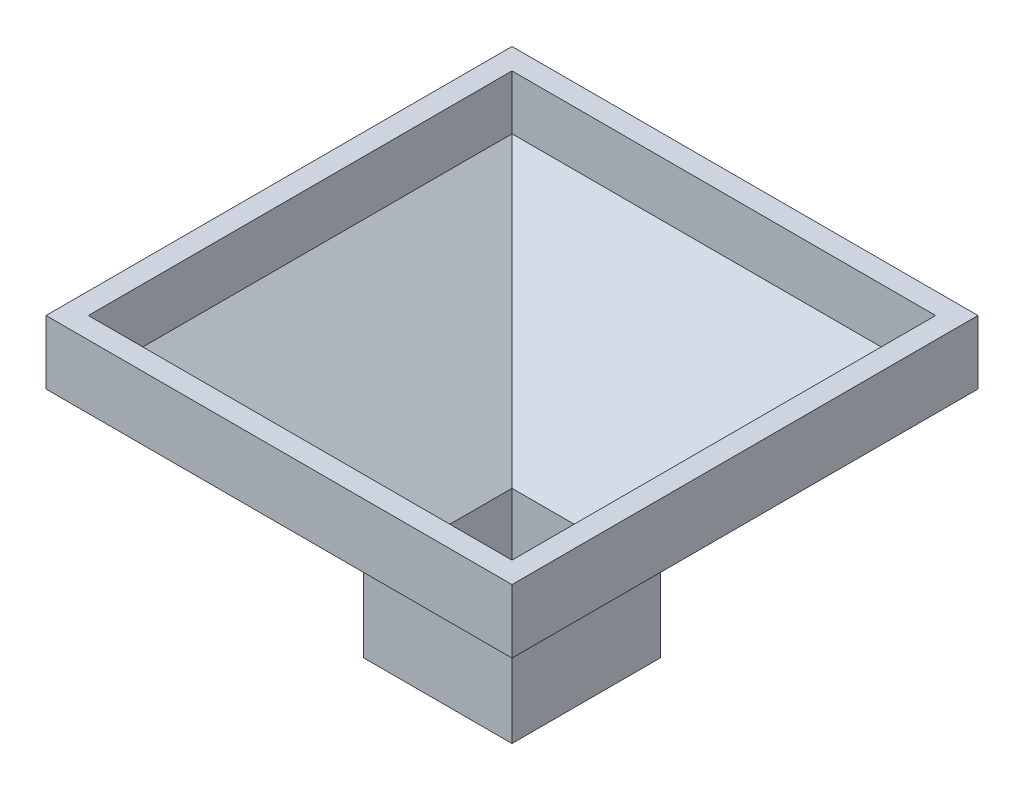
ISO-10303-21;
HEADER;
FILE_DESCRIPTION(('STEP AP214'),'2;1');
FILE_NAME('part.step','',(''),(''),'','','');
FILE_SCHEMA(('AUTOMOTIVE_DESIGN { 1 0 10303 214 1 1 1 1 }'));
ENDSEC;
DATA;
#1=APPLICATION_CONTEXT('core data for automotive mechanical design processes');
#2=APPLICATION_PROTOCOL_DEFINITION('international standard','automotive_design',2000,#1);
#3=PRODUCT_CONTEXT('',#1,'mechanical');
#4=PRODUCT('Part','Part','',(#3));
#5=PRODUCT_RELATED_PRODUCT_CATEGORY('part','',(#4));
#6=PRODUCT_DEFINITION_FORMATION('','',#4);
#7=PRODUCT_DEFINITION_CONTEXT('part definition',#1,'design');
#8=PRODUCT_DEFINITION('design','',#6,#7);
#9=PRODUCT_DEFINITION_SHAPE('','',#8);
#10=(LENGTH_UNIT() NAMED_UNIT(*) SI_UNIT(.MILLI.,.METRE.));
#11=(NAMED_UNIT(*) PLANE_ANGLE_UNIT() SI_UNIT($,.RADIAN.));
#12=(NAMED_UNIT(*) SI_UNIT($,.STERADIAN.) SOLID_ANGLE_UNIT());
#13=UNCERTAINTY_MEASURE_WITH_UNIT(LENGTH_MEASURE(1.E-05),#10,'distance_accuracy_value','');
#14=(GEOMETRIC_REPRESENTATION_CONTEXT(3) GLOBAL_UNCERTAINTY_ASSIGNED_CONTEXT((#13)) GLOBAL_UNIT_ASSIGNED_CONTEXT((#10,
#11,#12)) REPRESENTATION_CONTEXT('',''));
#15=CARTESIAN_POINT('',(0.,0.,0.));
#16=DIRECTION('',(0.,0.,1.));
#17=DIRECTION('',(1.,0.,0.));
#18=AXIS2_PLACEMENT_3D('',#15,#16,#17);
#19=CARTESIAN_POINT('',(0.,-140.,0.));
#20=DIRECTION('',(0.,-1.,0.));
#21=DIRECTION('',(0.,0.,-1.));
#22=AXIS2_PLACEMENT_3D('',#19,#20,#21);
#23=PLANE('',#22);
#24=DIRECTION('',(0.,0.,-1.));
#25=VECTOR('',#24,1.);
#26=CARTESIAN_POINT('',(-35.,-140.,0.));
#27=LINE('',#26,#25);
#28=CARTESIAN_POINT('',(-35.,-140.,35.));
#29=VERTEX_POINT('',#28);
#30=CARTESIAN_POINT('',(-35.,-140.,-35.));
#31=VERTEX_POINT('',#30);
#32=EDGE_CURVE('E217',#29,#31,#27,.T.);
#33=ORIENTED_EDGE('',*,*,#32,.T.);
#34=DIRECTION('',(1.,0.,0.));
#35=VECTOR('',#34,1.);
#36=CARTESIAN_POINT('',(0.,-140.,-35.));
#37=LINE('',#36,#35);
#38=CARTESIAN_POINT('',(35.,-140.,-35.));
#39=VERTEX_POINT('',#38);
#40=EDGE_CURVE('E271',#31,#39,#37,.T.);
#41=ORIENTED_EDGE('',*,*,#40,.T.);
#42=DIRECTION('',(0.,0.,1.));
#43=VECTOR('',#42,1.);
#44=CARTESIAN_POINT('',(35.,-140.,0.));
#45=LINE('',#44,#43);
#46=CARTESIAN_POINT('',(35.,-140.,35.));
#47=VERTEX_POINT('',#46);
#48=EDGE_CURVE('E273',#39,#47,#45,.T.);
#49=ORIENTED_EDGE('',*,*,#48,.T.);
#50=DIRECTION('',(-1.,0.,0.));
#51=VECTOR('',#50,1.);
#52=CARTESIAN_POINT('',(0.,-140.,35.));
#53=LINE('',#52,#51);
#54=EDGE_CURVE('E275',#47,#29,#53,.T.);
#55=ORIENTED_EDGE('',*,*,#54,.T.);
#56=EDGE_LOOP('',(#33,#41,#49,#55));
#57=FACE_BOUND('',#56,.T.);
#58=DIRECTION('',(0.,0.,1.));
#59=VECTOR('',#58,1.);
#60=CARTESIAN_POINT('',(25.,-140.,0.));
#61=LINE('',#60,#59);
#62=CARTESIAN_POINT('',(25.,-140.,-25.));
#63=VERTEX_POINT('',#62);
#64=CARTESIAN_POINT('',(25.,-140.,25.));
#65=VERTEX_POINT('',#64);
#66=EDGE_CURVE('E192',#63,#65,#61,.T.);
#67=ORIENTED_EDGE('',*,*,#66,.F.);
#68=DIRECTION('',(1.,0.,0.));
#69=VECTOR('',#68,1.);
#70=CARTESIAN_POINT('',(0.,-140.,-25.));
#71=LINE('',#70,#69);
#72=CARTESIAN_POINT('',(-25.,-140.,-25.));
#73=VERTEX_POINT('',#72);
#74=EDGE_CURVE('E204',#73,#63,#71,.T.);
#75=ORIENTED_EDGE('',*,*,#74,.F.);
#76=DIRECTION('',(0.,0.,1.));
#77=VECTOR('',#76,1.);
#78=CARTESIAN_POINT('',(-25.,-140.,0.));
#79=LINE('',#78,#77);
#80=CARTESIAN_POINT('',(-25.,-140.,25.));
#81=VERTEX_POINT('',#80);
#82=EDGE_CURVE('E211',#73,#81,#79,.T.);
#83=ORIENTED_EDGE('',*,*,#82,.T.);
#84=DIRECTION('',(1.,0.,0.));
#85=VECTOR('',#84,1.);
#86=CARTESIAN_POINT('',(0.,-140.,25.));
#87=LINE('',#86,#85);
#88=EDGE_CURVE('E209',#81,#65,#87,.T.);
#89=ORIENTED_EDGE('',*,*,#88,.T.);
#90=EDGE_LOOP('',(#67,#75,#83,#89));
#91=FACE_BOUND('',#90,.T.);
#92=ADVANCED_FACE('F72',(#57,#91),#23,.T.);
#93=CARTESIAN_POINT('',(0.,0.,0.));
#94=DIRECTION('',(0.,-1.,0.));
#95=DIRECTION('',(0.,0.,-1.));
#96=AXIS2_PLACEMENT_3D('',#93,#94,#95);
#97=PLANE('',#96);
#98=DIRECTION('',(0.,0.,-1.));
#99=VECTOR('',#98,1.);
#100=CARTESIAN_POINT('',(110.,0.,110.));
#101=LINE('',#100,#99);
#102=CARTESIAN_POINT('',(110.,0.,110.));
#103=VERTEX_POINT('',#102);
#104=CARTESIAN_POINT('',(110.,0.,-110.));
#105=VERTEX_POINT('',#104);
#106=EDGE_CURVE('E323',#103,#105,#101,.T.);
#107=ORIENTED_EDGE('',*,*,#106,.T.);
#108=DIRECTION('',(-1.,0.,0.));
#109=VECTOR('',#108,1.);
#110=CARTESIAN_POINT('',(-110.,0.,-110.));
#111=LINE('',#110,#109);
#112=CARTESIAN_POINT('',(-110.,0.,-110.));
#113=VERTEX_POINT('',#112);
#114=EDGE_CURVE('E326',#105,#113,#111,.T.);
#115=ORIENTED_EDGE('',*,*,#114,.T.);
#116=DIRECTION('',(0.,0.,1.));
#117=VECTOR('',#116,1.);
#118=CARTESIAN_POINT('',(-110.,0.,110.));
#119=LINE('',#118,#117);
#120=CARTESIAN_POINT('',(-110.,0.,110.));
#121=VERTEX_POINT('',#120);
#122=EDGE_CURVE('E329',#113,#121,#119,.T.);
#123=ORIENTED_EDGE('',*,*,#122,.T.);
#124=DIRECTION('',(1.,0.,0.));
#125=VECTOR('',#124,1.);
#126=CARTESIAN_POINT('',(-110.,0.,110.));
#127=LINE('',#126,#125);
#128=EDGE_CURVE('E332',#121,#103,#127,.T.);
#129=ORIENTED_EDGE('',*,*,#128,.T.);
#130=EDGE_LOOP('',(#107,#115,#123,#129));
#131=FACE_BOUND('',#130,.T.);
#132=DIRECTION('',(0.,0.,-1.));
#133=VECTOR('',#132,1.);
#134=CARTESIAN_POINT('',(100.,0.,110.));
#135=LINE('',#134,#133);
#136=CARTESIAN_POINT('',(100.,0.,100.));
#137=VERTEX_POINT('',#136);
#138=CARTESIAN_POINT('',(100.,0.,-100.));
#139=VERTEX_POINT('',#138);
#140=EDGE_CURVE('E222',#137,#139,#135,.T.);
#141=ORIENTED_EDGE('',*,*,#140,.F.);
#142=DIRECTION('',(1.,0.,0.));
#143=VECTOR('',#142,1.);
#144=CARTESIAN_POINT('',(-110.,0.,100.));
#145=LINE('',#144,#143);
#146=CARTESIAN_POINT('',(-100.,0.,100.));
#147=VERTEX_POINT('',#146);
#148=EDGE_CURVE('E227',#147,#137,#145,.T.);
#149=ORIENTED_EDGE('',*,*,#148,.F.);
#150=DIRECTION('',(0.,0.,1.));
#151=VECTOR('',#150,1.);
#152=CARTESIAN_POINT('',(-100.,0.,110.));
#153=LINE('',#152,#151);
#154=CARTESIAN_POINT('',(-100.,0.,-100.));
#155=VERTEX_POINT('',#154);
#156=EDGE_CURVE('E97',#155,#147,#153,.T.);
#157=ORIENTED_EDGE('',*,*,#156,.F.);
#158=DIRECTION('',(-1.,0.,0.));
#159=VECTOR('',#158,1.);
#160=CARTESIAN_POINT('',(-110.,0.,-100.));
#161=LINE('',#160,#159);
#162=EDGE_CURVE('E263',#139,#155,#161,.T.);
#163=ORIENTED_EDGE('',*,*,#162,.F.);
#164=EDGE_LOOP('',(#141,#149,#157,#163));
#165=FACE_BOUND('',#164,.T.);
#166=ADVANCED_FACE('F346',(#131,#165),#97,.F.);
#167=CARTESIAN_POINT('',(110.,-100.,110.));
#168=DIRECTION('',(1.,0.,0.));
#169=DIRECTION('',(0.,0.,-1.));
#170=AXIS2_PLACEMENT_3D('',#167,#168,#169);
#171=PLANE('',#170);
#172=DIRECTION('',(0.,1.,0.));
#173=VECTOR('',#172,1.);
#174=CARTESIAN_POINT('',(110.,-100.,110.));
#175=LINE('',#174,#173);
#176=CARTESIAN_POINT('',(110.,-30.0613685396755,110.));
#177=VERTEX_POINT('',#176);
#178=EDGE_CURVE('E13',#177,#103,#175,.T.);
#179=ORIENTED_EDGE('',*,*,#178,.F.);
#180=DIRECTION('',(0.,0.,1.));
#181=VECTOR('',#180,1.);
#182=CARTESIAN_POINT('',(110.,-30.0613685396755,110.));
#183=LINE('',#182,#181);
#184=CARTESIAN_POINT('',(110.,-30.0613685396755,-110.));
#185=VERTEX_POINT('',#184);
#186=EDGE_CURVE('E320',#177,#185,#183,.F.);
#187=ORIENTED_EDGE('',*,*,#186,.T.);
#188=DIRECTION('',(0.,1.,0.));
#189=VECTOR('',#188,1.);
#190=CARTESIAN_POINT('',(110.,-100.,-110.));
#191=LINE('',#190,#189);
#192=EDGE_CURVE('E76',#185,#105,#191,.T.);
#193=ORIENTED_EDGE('',*,*,#192,.T.);
#194=ORIENTED_EDGE('',*,*,#106,.F.);
#195=EDGE_LOOP('',(#179,#187,#193,#194));
#196=FACE_BOUND('',#195,.T.);
#197=ADVANCED_FACE('F74',(#196),#171,.T.);
#198=CARTESIAN_POINT('',(-110.,-100.,110.));
#199=DIRECTION('',(0.,0.,1.));
#200=DIRECTION('',(1.,0.,0.));
#201=AXIS2_PLACEMENT_3D('',#198,#199,#200);
#202=PLANE('',#201);
#203=DIRECTION('',(0.,1.,0.));
#204=VECTOR('',#203,1.);
#205=CARTESIAN_POINT('',(-110.,-100.,110.));
#206=LINE('',#205,#204);
#207=CARTESIAN_POINT('',(-110.,-30.0613685396755,110.));
#208=VERTEX_POINT('',#207);
#209=EDGE_CURVE('E81',#208,#121,#206,.T.);
#210=ORIENTED_EDGE('',*,*,#209,.F.);
#211=DIRECTION('',(-1.,0.,0.));
#212=VECTOR('',#211,1.);
#213=CARTESIAN_POINT('',(-110.,-30.0613685396755,110.));
#214=LINE('',#213,#212);
#215=EDGE_CURVE('E306',#208,#177,#214,.F.);
#216=ORIENTED_EDGE('',*,*,#215,.T.);
#217=ORIENTED_EDGE('',*,*,#178,.T.);
#218=ORIENTED_EDGE('',*,*,#128,.F.);
#219=EDGE_LOOP('',(#210,#216,#217,#218));
#220=FACE_BOUND('',#219,.T.);
#221=ADVANCED_FACE('F351',(#220),#202,.T.);
#222=CARTESIAN_POINT('',(-110.,-100.,110.));
#223=DIRECTION('',(-1.,0.,0.));
#224=DIRECTION('',(0.,0.,1.));
#225=AXIS2_PLACEMENT_3D('',#222,#223,#224);
#226=PLANE('',#225);
#227=DIRECTION('',(0.,1.,0.));
#228=VECTOR('',#227,1.);
#229=CARTESIAN_POINT('',(-110.,-100.,-110.));
#230=LINE('',#229,#228);
#231=CARTESIAN_POINT('',(-110.,-30.0613685396755,-110.));
#232=VERTEX_POINT('',#231);
#233=EDGE_CURVE('E335',#232,#113,#230,.T.);
#234=ORIENTED_EDGE('',*,*,#233,.F.);
#235=DIRECTION('',(0.,0.,-1.));
#236=VECTOR('',#235,1.);
#237=CARTESIAN_POINT('',(-110.,-30.0613685396755,110.));
#238=LINE('',#237,#236);
#239=EDGE_CURVE('E314',#232,#208,#238,.F.);
#240=ORIENTED_EDGE('',*,*,#239,.T.);
#241=ORIENTED_EDGE('',*,*,#209,.T.);
#242=ORIENTED_EDGE('',*,*,#122,.F.);
#243=EDGE_LOOP('',(#234,#240,#241,#242));
#244=FACE_BOUND('',#243,.T.);
#245=ADVANCED_FACE('F361',(#244),#226,.T.);
#246=CARTESIAN_POINT('',(-110.,-100.,-110.));
#247=DIRECTION('',(0.,0.,-1.));
#248=DIRECTION('',(-1.,0.,0.));
#249=AXIS2_PLACEMENT_3D('',#246,#247,#248);
#250=PLANE('',#249);
#251=ORIENTED_EDGE('',*,*,#192,.F.);
#252=DIRECTION('',(1.,0.,0.));
#253=VECTOR('',#252,1.);
#254=CARTESIAN_POINT('',(-110.,-30.0613685396755,-110.));
#255=LINE('',#254,#253);
#256=EDGE_CURVE('E317',#185,#232,#255,.F.);
#257=ORIENTED_EDGE('',*,*,#256,.T.);
#258=ORIENTED_EDGE('',*,*,#233,.T.);
#259=ORIENTED_EDGE('',*,*,#114,.F.);
#260=EDGE_LOOP('',(#251,#257,#258,#259));
#261=FACE_BOUND('',#260,.T.);
#262=ADVANCED_FACE('F344',(#261),#250,.T.);
#263=CARTESIAN_POINT('',(35.,-100.,-35.));
#264=DIRECTION('',(-0.681998360062498,0.731353701619171,0.));
#265=DIRECTION('',(-0.731353701619171,-0.681998360062498,0.));
#266=AXIS2_PLACEMENT_3D('',#263,#264,#265);
#267=PLANE('',#266);
#268=DIRECTION('',(-0.59032408103298,-0.550486111273605,-0.59032408103298));
#269=VECTOR('',#268,1.);
#270=CARTESIAN_POINT('',(10.6062235546797,-122.747564543131,10.6062235546797));
#271=LINE('',#270,#269);
#272=CARTESIAN_POINT('',(35.,-100.,35.));
#273=VERTEX_POINT('',#272);
#274=EDGE_CURVE('E301',#177,#273,#271,.T.);
#275=ORIENTED_EDGE('',*,*,#274,.T.);
#276=DIRECTION('',(0.,0.,1.));
#277=VECTOR('',#276,1.);
#278=CARTESIAN_POINT('',(35.,-100.,-35.));
#279=LINE('',#278,#277);
#280=CARTESIAN_POINT('',(35.,-100.,-35.));
#281=VERTEX_POINT('',#280);
#282=EDGE_CURVE('E289',#281,#273,#279,.T.);
#283=ORIENTED_EDGE('',*,*,#282,.F.);
#284=DIRECTION('',(-0.59032408103298,-0.550486111273605,0.59032408103298));
#285=VECTOR('',#284,1.);
#286=CARTESIAN_POINT('',(10.6062235546797,-122.747564543131,-10.6062235546797));
#287=LINE('',#286,#285);
#288=EDGE_CURVE('E304',#185,#281,#287,.T.);
#289=ORIENTED_EDGE('',*,*,#288,.F.);
#290=ORIENTED_EDGE('',*,*,#186,.F.);
#291=EDGE_LOOP('',(#275,#283,#289,#290));
#292=FACE_BOUND('',#291,.T.);
#293=ADVANCED_FACE('F368',(#292),#267,.F.);
#294=CARTESIAN_POINT('',(-35.,-100.,-35.));
#295=DIRECTION('',(0.,0.731353701619171,0.681998360062498));
#296=DIRECTION('',(0.,-0.681998360062498,0.731353701619171));
#297=AXIS2_PLACEMENT_3D('',#294,#295,#296);
#298=PLANE('',#297);
#299=ORIENTED_EDGE('',*,*,#288,.T.);
#300=DIRECTION('',(1.,0.,0.));
#301=VECTOR('',#300,1.);
#302=CARTESIAN_POINT('',(-35.,-100.,-35.));
#303=LINE('',#302,#301);
#304=CARTESIAN_POINT('',(-35.,-100.,-35.));
#305=VERTEX_POINT('',#304);
#306=EDGE_CURVE('E298',#305,#281,#303,.T.);
#307=ORIENTED_EDGE('',*,*,#306,.F.);
#308=DIRECTION('',(0.59032408103298,-0.550486111273605,0.59032408103298));
#309=VECTOR('',#308,1.);
#310=CARTESIAN_POINT('',(-35.,-100.,-35.));
#311=LINE('',#310,#309);
#312=EDGE_CURVE('E307',#232,#305,#311,.T.);
#313=ORIENTED_EDGE('',*,*,#312,.F.);
#314=ORIENTED_EDGE('',*,*,#256,.F.);
#315=EDGE_LOOP('',(#299,#307,#313,#314));
#316=FACE_BOUND('',#315,.T.);
#317=ADVANCED_FACE('F402',(#316),#298,.F.);
#318=CARTESIAN_POINT('',(-35.,-100.,-35.));
#319=DIRECTION('',(0.681998360062498,0.731353701619171,0.));
#320=DIRECTION('',(-0.731353701619171,0.681998360062498,0.));
#321=AXIS2_PLACEMENT_3D('',#318,#319,#320);
#322=PLANE('',#321);
#323=ORIENTED_EDGE('',*,*,#312,.T.);
#324=DIRECTION('',(0.,0.,-1.));
#325=VECTOR('',#324,1.);
#326=CARTESIAN_POINT('',(-35.,-100.,-35.));
#327=LINE('',#326,#325);
#328=CARTESIAN_POINT('',(-35.,-100.,35.));
#329=VERTEX_POINT('',#328);
#330=EDGE_CURVE('E295',#329,#305,#327,.T.);
#331=ORIENTED_EDGE('',*,*,#330,.F.);
#332=DIRECTION('',(0.59032408103298,-0.550486111273605,-0.59032408103298));
#333=VECTOR('',#332,1.);
#334=CARTESIAN_POINT('',(-35.,-100.,35.));
#335=LINE('',#334,#333);
#336=EDGE_CURVE('E303',#208,#329,#335,.T.);
#337=ORIENTED_EDGE('',*,*,#336,.F.);
#338=ORIENTED_EDGE('',*,*,#239,.F.);
#339=EDGE_LOOP('',(#323,#331,#337,#338));
#340=FACE_BOUND('',#339,.T.);
#341=ADVANCED_FACE('F359',(#340),#322,.F.);
#342=CARTESIAN_POINT('',(-35.,-100.,35.));
#343=DIRECTION('',(0.,0.731353701619171,-0.681998360062498));
#344=DIRECTION('',(0.,0.681998360062498,0.731353701619171));
#345=AXIS2_PLACEMENT_3D('',#342,#343,#344);
#346=PLANE('',#345);
#347=ORIENTED_EDGE('',*,*,#336,.T.);
#348=DIRECTION('',(-1.,0.,0.));
#349=VECTOR('',#348,1.);
#350=CARTESIAN_POINT('',(-35.,-100.,35.));
#351=LINE('',#350,#349);
#352=EDGE_CURVE('E292',#273,#329,#351,.T.);
#353=ORIENTED_EDGE('',*,*,#352,.F.);
#354=ORIENTED_EDGE('',*,*,#274,.F.);
#355=ORIENTED_EDGE('',*,*,#215,.F.);
#356=EDGE_LOOP('',(#347,#353,#354,#355));
#357=FACE_BOUND('',#356,.T.);
#358=ADVANCED_FACE('F355',(#357),#346,.F.);
#359=CARTESIAN_POINT('',(0.,-140.,-35.));
#360=DIRECTION('',(0.,0.,1.));
#361=DIRECTION('',(1.,0.,0.));
#362=AXIS2_PLACEMENT_3D('',#359,#360,#361);
#363=PLANE('',#362);
#364=ORIENTED_EDGE('',*,*,#306,.T.);
#365=DIRECTION('',(0.,1.,0.));
#366=VECTOR('',#365,1.);
#367=CARTESIAN_POINT('',(35.,-140.,-35.));
#368=LINE('',#367,#366);
#369=EDGE_CURVE('E283',#39,#281,#368,.T.);
#370=ORIENTED_EDGE('',*,*,#369,.F.);
#371=ORIENTED_EDGE('',*,*,#40,.F.);
#372=DIRECTION('',(0.,1.,0.));
#373=VECTOR('',#372,1.);
#374=CARTESIAN_POINT('',(-35.,-140.,-35.));
#375=LINE('',#374,#373);
#376=EDGE_CURVE('E286',#31,#305,#375,.T.);
#377=ORIENTED_EDGE('',*,*,#376,.T.);
#378=EDGE_LOOP('',(#364,#370,#371,#377));
#379=FACE_BOUND('',#378,.T.);
#380=ADVANCED_FACE('F391',(#379),#363,.F.);
#381=CARTESIAN_POINT('',(35.,-140.,0.));
#382=DIRECTION('',(-1.,0.,0.));
#383=DIRECTION('',(0.,0.,1.));
#384=AXIS2_PLACEMENT_3D('',#381,#382,#383);
#385=PLANE('',#384);
#386=ORIENTED_EDGE('',*,*,#282,.T.);
#387=DIRECTION('',(0.,1.,0.));
#388=VECTOR('',#387,1.);
#389=CARTESIAN_POINT('',(35.,-140.,35.));
#390=LINE('',#389,#388);
#391=EDGE_CURVE('E280',#47,#273,#390,.T.);
#392=ORIENTED_EDGE('',*,*,#391,.F.);
#393=ORIENTED_EDGE('',*,*,#48,.F.);
#394=ORIENTED_EDGE('',*,*,#369,.T.);
#395=EDGE_LOOP('',(#386,#392,#393,#394));
#396=FACE_BOUND('',#395,.T.);
#397=ADVANCED_FACE('F387',(#396),#385,.F.);
#398=CARTESIAN_POINT('',(0.,-140.,35.));
#399=DIRECTION('',(0.,0.,-1.));
#400=DIRECTION('',(-1.,0.,0.));
#401=AXIS2_PLACEMENT_3D('',#398,#399,#400);
#402=PLANE('',#401);
#403=ORIENTED_EDGE('',*,*,#352,.T.);
#404=DIRECTION('',(0.,1.,0.));
#405=VECTOR('',#404,1.);
#406=CARTESIAN_POINT('',(-35.,-140.,35.));
#407=LINE('',#406,#405);
#408=EDGE_CURVE('E277',#29,#329,#407,.T.);
#409=ORIENTED_EDGE('',*,*,#408,.F.);
#410=ORIENTED_EDGE('',*,*,#54,.F.);
#411=ORIENTED_EDGE('',*,*,#391,.T.);
#412=EDGE_LOOP('',(#403,#409,#410,#411));
#413=FACE_BOUND('',#412,.T.);
#414=ADVANCED_FACE('F383',(#413),#402,.F.);
#415=CARTESIAN_POINT('',(-35.,-140.,0.));
#416=DIRECTION('',(1.,0.,0.));
#417=DIRECTION('',(0.,0.,-1.));
#418=AXIS2_PLACEMENT_3D('',#415,#416,#417);
#419=PLANE('',#418);
#420=ORIENTED_EDGE('',*,*,#330,.T.);
#421=ORIENTED_EDGE('',*,*,#376,.F.);
#422=ORIENTED_EDGE('',*,*,#32,.F.);
#423=ORIENTED_EDGE('',*,*,#408,.T.);
#424=EDGE_LOOP('',(#420,#421,#422,#423));
#425=FACE_BOUND('',#424,.T.);
#426=ADVANCED_FACE('F386',(#425),#419,.F.);
#427=CARTESIAN_POINT('',(100.,-100.,110.));
#428=DIRECTION('',(1.,0.,0.));
#429=DIRECTION('',(0.,0.,-1.));
#430=AXIS2_PLACEMENT_3D('',#427,#428,#429);
#431=PLANE('',#430);
#432=DIRECTION('',(0.,1.,0.));
#433=VECTOR('',#432,1.);
#434=CARTESIAN_POINT('',(100.,-100.,100.));
#435=LINE('',#434,#433);
#436=CARTESIAN_POINT('',(100.,-25.7132447900661,100.));
#437=VERTEX_POINT('',#436);
#438=EDGE_CURVE('E215',#437,#137,#435,.T.);
#439=ORIENTED_EDGE('',*,*,#438,.T.);
#440=ORIENTED_EDGE('',*,*,#140,.T.);
#441=DIRECTION('',(0.,1.,0.));
#442=VECTOR('',#441,1.);
#443=CARTESIAN_POINT('',(100.,-100.,-100.));
#444=LINE('',#443,#442);
#445=CARTESIAN_POINT('',(100.,-25.7132447900661,-100.));
#446=VERTEX_POINT('',#445);
#447=EDGE_CURVE('E224',#446,#139,#444,.T.);
#448=ORIENTED_EDGE('',*,*,#447,.F.);
#449=DIRECTION('',(0.,0.,1.));
#450=VECTOR('',#449,1.);
#451=CARTESIAN_POINT('',(100.,-25.7132447900662,110.));
#452=LINE('',#451,#450);
#453=EDGE_CURVE('E219',#437,#446,#452,.F.);
#454=ORIENTED_EDGE('',*,*,#453,.F.);
#455=EDGE_LOOP('',(#439,#440,#448,#454));
#456=FACE_BOUND('',#455,.T.);
#457=ADVANCED_FACE('F398',(#456),#431,.F.);
#458=CARTESIAN_POINT('',(-110.,-100.,100.));
#459=DIRECTION('',(0.,0.,1.));
#460=DIRECTION('',(1.,0.,0.));
#461=AXIS2_PLACEMENT_3D('',#458,#459,#460);
#462=PLANE('',#461);
#463=DIRECTION('',(0.,1.,0.));
#464=VECTOR('',#463,1.);
#465=CARTESIAN_POINT('',(-100.,-100.,100.));
#466=LINE('',#465,#464);
#467=CARTESIAN_POINT('',(-100.,-25.7132447900661,100.));
#468=VERTEX_POINT('',#467);
#469=EDGE_CURVE('E218',#468,#147,#466,.T.);
#470=ORIENTED_EDGE('',*,*,#469,.T.);
#471=ORIENTED_EDGE('',*,*,#148,.T.);
#472=ORIENTED_EDGE('',*,*,#438,.F.);
#473=DIRECTION('',(-1.,0.,0.));
#474=VECTOR('',#473,1.);
#475=CARTESIAN_POINT('',(-110.,-25.7132447900661,100.));
#476=LINE('',#475,#474);
#477=EDGE_CURVE('E229',#468,#437,#476,.F.);
#478=ORIENTED_EDGE('',*,*,#477,.F.);
#479=EDGE_LOOP('',(#470,#471,#472,#478));
#480=FACE_BOUND('',#479,.T.);
#481=ADVANCED_FACE('F447',(#480),#462,.F.);
#482=CARTESIAN_POINT('',(-100.,-100.,110.));
#483=DIRECTION('',(-1.,0.,0.));
#484=DIRECTION('',(0.,0.,1.));
#485=AXIS2_PLACEMENT_3D('',#482,#483,#484);
#486=PLANE('',#485);
#487=DIRECTION('',(0.,1.,0.));
#488=VECTOR('',#487,1.);
#489=CARTESIAN_POINT('',(-100.,-100.,-100.));
#490=LINE('',#489,#488);
#491=CARTESIAN_POINT('',(-100.,-25.7132447900661,-100.));
#492=VERTEX_POINT('',#491);
#493=EDGE_CURVE('E226',#492,#155,#490,.T.);
#494=ORIENTED_EDGE('',*,*,#493,.T.);
#495=ORIENTED_EDGE('',*,*,#156,.T.);
#496=ORIENTED_EDGE('',*,*,#469,.F.);
#497=DIRECTION('',(0.,0.,-1.));
#498=VECTOR('',#497,1.);
#499=CARTESIAN_POINT('',(-100.,-25.7132447900661,110.));
#500=LINE('',#499,#498);
#501=EDGE_CURVE('E232',#492,#468,#500,.F.);
#502=ORIENTED_EDGE('',*,*,#501,.F.);
#503=EDGE_LOOP('',(#494,#495,#496,#502));
#504=FACE_BOUND('',#503,.T.);
#505=ADVANCED_FACE('F455',(#504),#486,.F.);
#506=CARTESIAN_POINT('',(-110.,-100.,-100.));
#507=DIRECTION('',(0.,0.,-1.));
#508=DIRECTION('',(-1.,0.,0.));
#509=AXIS2_PLACEMENT_3D('',#506,#507,#508);
#510=PLANE('',#509);
#511=ORIENTED_EDGE('',*,*,#447,.T.);
#512=ORIENTED_EDGE('',*,*,#162,.T.);
#513=ORIENTED_EDGE('',*,*,#493,.F.);
#514=DIRECTION('',(1.,0.,0.));
#515=VECTOR('',#514,1.);
#516=CARTESIAN_POINT('',(-110.,-25.7132447900662,-100.));
#517=LINE('',#516,#515);
#518=EDGE_CURVE('E223',#446,#492,#517,.F.);
#519=ORIENTED_EDGE('',*,*,#518,.F.);
#520=EDGE_LOOP('',(#511,#512,#513,#519));
#521=FACE_BOUND('',#520,.T.);
#522=ADVANCED_FACE('F464',(#521),#510,.F.);
#523=CARTESIAN_POINT('',(28.180016399375,-92.6864629838083,-35.));
#524=DIRECTION('',(-0.681998360062498,0.731353701619171,0.));
#525=DIRECTION('',(-0.731353701619171,-0.681998360062498,0.));
#526=AXIS2_PLACEMENT_3D('',#523,#524,#525);
#527=PLANE('',#526);
#528=DIRECTION('',(-0.59032408103298,-0.550486111273605,-0.59032408103298));
#529=VECTOR('',#528,1.);
#530=CARTESIAN_POINT('',(6.16288502997471,-113.217770139249,6.1628850299747));
#531=LINE('',#530,#529);
#532=CARTESIAN_POINT('',(25.,-95.6518762503907,25.));
#533=VERTEX_POINT('',#532);
#534=EDGE_CURVE('E239',#437,#533,#531,.T.);
#535=ORIENTED_EDGE('',*,*,#534,.F.);
#536=ORIENTED_EDGE('',*,*,#453,.T.);
#537=DIRECTION('',(-0.59032408103298,-0.550486111273605,0.59032408103298));
#538=VECTOR('',#537,1.);
#539=CARTESIAN_POINT('',(6.16288502997471,-113.217770139249,-6.1628850299747));
#540=LINE('',#539,#538);
#541=CARTESIAN_POINT('',(25.,-95.6518762503907,-25.));
#542=VERTEX_POINT('',#541);
#543=EDGE_CURVE('E233',#446,#542,#540,.T.);
#544=ORIENTED_EDGE('',*,*,#543,.T.);
#545=DIRECTION('',(0.,0.,-1.));
#546=VECTOR('',#545,1.);
#547=CARTESIAN_POINT('',(25.,-95.6518762503907,0.));
#548=LINE('',#547,#546);
#549=EDGE_CURVE('E195',#542,#533,#548,.F.);
#550=ORIENTED_EDGE('',*,*,#549,.T.);
#551=EDGE_LOOP('',(#535,#536,#544,#550));
#552=FACE_BOUND('',#551,.T.);
#553=ADVANCED_FACE('F472',(#552),#527,.T.);
#554=CARTESIAN_POINT('',(-35.,-92.6864629838083,-28.180016399375));
#555=DIRECTION('',(0.,0.731353701619171,0.681998360062498));
#556=DIRECTION('',(0.,-0.681998360062498,0.731353701619171));
#557=AXIS2_PLACEMENT_3D('',#554,#555,#556);
#558=PLANE('',#557);
#559=ORIENTED_EDGE('',*,*,#543,.F.);
#560=ORIENTED_EDGE('',*,*,#518,.T.);
#561=DIRECTION('',(0.59032408103298,-0.550486111273605,0.59032408103298));
#562=VECTOR('',#561,1.);
#563=CARTESIAN_POINT('',(-30.556661475295,-90.4702055961182,-30.556661475295));
#564=LINE('',#563,#562);
#565=CARTESIAN_POINT('',(-25.,-95.6518762503907,-25.));
#566=VERTEX_POINT('',#565);
#567=EDGE_CURVE('E247',#492,#566,#564,.T.);
#568=ORIENTED_EDGE('',*,*,#567,.T.);
#569=DIRECTION('',(-1.,0.,0.));
#570=VECTOR('',#569,1.);
#571=CARTESIAN_POINT('',(0.,-95.6518762503907,-25.));
#572=LINE('',#571,#570);
#573=EDGE_CURVE('E243',#566,#542,#572,.F.);
#574=ORIENTED_EDGE('',*,*,#573,.T.);
#575=EDGE_LOOP('',(#559,#560,#568,#574));
#576=FACE_BOUND('',#575,.T.);
#577=ADVANCED_FACE('F481',(#576),#558,.T.);
#578=CARTESIAN_POINT('',(-28.180016399375,-92.6864629838083,-35.));
#579=DIRECTION('',(0.681998360062498,0.731353701619171,0.));
#580=DIRECTION('',(-0.731353701619171,0.681998360062498,0.));
#581=AXIS2_PLACEMENT_3D('',#578,#579,#580);
#582=PLANE('',#581);
#583=ORIENTED_EDGE('',*,*,#567,.F.);
#584=ORIENTED_EDGE('',*,*,#501,.T.);
#585=DIRECTION('',(0.59032408103298,-0.550486111273605,-0.59032408103298));
#586=VECTOR('',#585,1.);
#587=CARTESIAN_POINT('',(-30.556661475295,-90.4702055961182,30.556661475295));
#588=LINE('',#587,#586);
#589=CARTESIAN_POINT('',(-25.,-95.6518762503907,25.));
#590=VERTEX_POINT('',#589);
#591=EDGE_CURVE('E242',#468,#590,#588,.T.);
#592=ORIENTED_EDGE('',*,*,#591,.T.);
#593=DIRECTION('',(0.,0.,1.));
#594=VECTOR('',#593,1.);
#595=CARTESIAN_POINT('',(-25.,-95.6518762503907,0.));
#596=LINE('',#595,#594);
#597=EDGE_CURVE('E249',#590,#566,#596,.F.);
#598=ORIENTED_EDGE('',*,*,#597,.T.);
#599=EDGE_LOOP('',(#583,#584,#592,#598));
#600=FACE_BOUND('',#599,.T.);
#601=ADVANCED_FACE('F490',(#600),#582,.T.);
#602=CARTESIAN_POINT('',(-35.,-92.6864629838083,28.180016399375));
#603=DIRECTION('',(0.,0.731353701619171,-0.681998360062498));
#604=DIRECTION('',(0.,0.681998360062498,0.731353701619171));
#605=AXIS2_PLACEMENT_3D('',#602,#603,#604);
#606=PLANE('',#605);
#607=ORIENTED_EDGE('',*,*,#591,.F.);
#608=ORIENTED_EDGE('',*,*,#477,.T.);
#609=ORIENTED_EDGE('',*,*,#534,.T.);
#610=DIRECTION('',(1.,0.,0.));
#611=VECTOR('',#610,1.);
#612=CARTESIAN_POINT('',(0.,-95.6518762503907,25.));
#613=LINE('',#612,#611);
#614=EDGE_CURVE('E245',#533,#590,#613,.F.);
#615=ORIENTED_EDGE('',*,*,#614,.T.);
#616=EDGE_LOOP('',(#607,#608,#609,#615));
#617=FACE_BOUND('',#616,.T.);
#618=ADVANCED_FACE('F498',(#617),#606,.T.);
#619=CARTESIAN_POINT('',(0.,-140.,-25.));
#620=DIRECTION('',(0.,0.,1.));
#621=DIRECTION('',(1.,0.,0.));
#622=AXIS2_PLACEMENT_3D('',#619,#620,#621);
#623=PLANE('',#622);
#624=DIRECTION('',(0.,1.,0.));
#625=VECTOR('',#624,1.);
#626=CARTESIAN_POINT('',(25.,-140.,-25.));
#627=LINE('',#626,#625);
#628=EDGE_CURVE('E188',#63,#542,#627,.T.);
#629=ORIENTED_EDGE('',*,*,#628,.T.);
#630=ORIENTED_EDGE('',*,*,#573,.F.);
#631=DIRECTION('',(0.,1.,0.));
#632=VECTOR('',#631,1.);
#633=CARTESIAN_POINT('',(-25.,-140.,-25.));
#634=LINE('',#633,#632);
#635=EDGE_CURVE('E200',#73,#566,#634,.T.);
#636=ORIENTED_EDGE('',*,*,#635,.F.);
#637=ORIENTED_EDGE('',*,*,#74,.T.);
#638=EDGE_LOOP('',(#629,#630,#636,#637));
#639=FACE_BOUND('',#638,.T.);
#640=ADVANCED_FACE('F205',(#639),#623,.T.);
#641=CARTESIAN_POINT('',(25.,-140.,0.));
#642=DIRECTION('',(-1.,0.,0.));
#643=DIRECTION('',(0.,0.,1.));
#644=AXIS2_PLACEMENT_3D('',#641,#642,#643);
#645=PLANE('',#644);
#646=DIRECTION('',(0.,1.,0.));
#647=VECTOR('',#646,1.);
#648=CARTESIAN_POINT('',(25.,-140.,25.));
#649=LINE('',#648,#647);
#650=EDGE_CURVE('E201',#65,#533,#649,.T.);
#651=ORIENTED_EDGE('',*,*,#650,.T.);
#652=ORIENTED_EDGE('',*,*,#549,.F.);
#653=ORIENTED_EDGE('',*,*,#628,.F.);
#654=ORIENTED_EDGE('',*,*,#66,.T.);
#655=EDGE_LOOP('',(#651,#652,#653,#654));
#656=FACE_BOUND('',#655,.T.);
#657=ADVANCED_FACE('F190',(#656),#645,.T.);
#658=CARTESIAN_POINT('',(0.,-140.,25.));
#659=DIRECTION('',(0.,0.,-1.));
#660=DIRECTION('',(-1.,0.,0.));
#661=AXIS2_PLACEMENT_3D('',#658,#659,#660);
#662=PLANE('',#661);
#663=DIRECTION('',(0.,1.,0.));
#664=VECTOR('',#663,1.);
#665=CARTESIAN_POINT('',(-25.,-140.,25.));
#666=LINE('',#665,#664);
#667=EDGE_CURVE('E89',#81,#590,#666,.T.);
#668=ORIENTED_EDGE('',*,*,#667,.T.);
#669=ORIENTED_EDGE('',*,*,#614,.F.);
#670=ORIENTED_EDGE('',*,*,#650,.F.);
#671=ORIENTED_EDGE('',*,*,#88,.F.);
#672=EDGE_LOOP('',(#668,#669,#670,#671));
#673=FACE_BOUND('',#672,.T.);
#674=ADVANCED_FACE('F532',(#673),#662,.T.);
#675=CARTESIAN_POINT('',(-25.,-140.,0.));
#676=DIRECTION('',(1.,0.,0.));
#677=DIRECTION('',(0.,0.,-1.));
#678=AXIS2_PLACEMENT_3D('',#675,#676,#677);
#679=PLANE('',#678);
#680=ORIENTED_EDGE('',*,*,#635,.T.);
#681=ORIENTED_EDGE('',*,*,#597,.F.);
#682=ORIENTED_EDGE('',*,*,#667,.F.);
#683=ORIENTED_EDGE('',*,*,#82,.F.);
#684=EDGE_LOOP('',(#680,#681,#682,#683));
#685=FACE_BOUND('',#684,.T.);
#686=ADVANCED_FACE('F381',(#685),#679,.T.);
#687=CLOSED_SHELL('',(#92,#166,#197,#221,#245,#262,#293,#317,#341,#358,#380,#397,#414,#426,#457,
#481,#505,#522,#553,#577,#601,#618,#640,#657,#674,#686));
#688=MANIFOLD_SOLID_BREP('B2',#687);
#689=ADVANCED_BREP_SHAPE_REPRESENTATION('',(#18,#688),#14);
#690=SHAPE_DEFINITION_REPRESENTATION(#9,#689);
ENDSEC;
END-ISO-10303-21;
